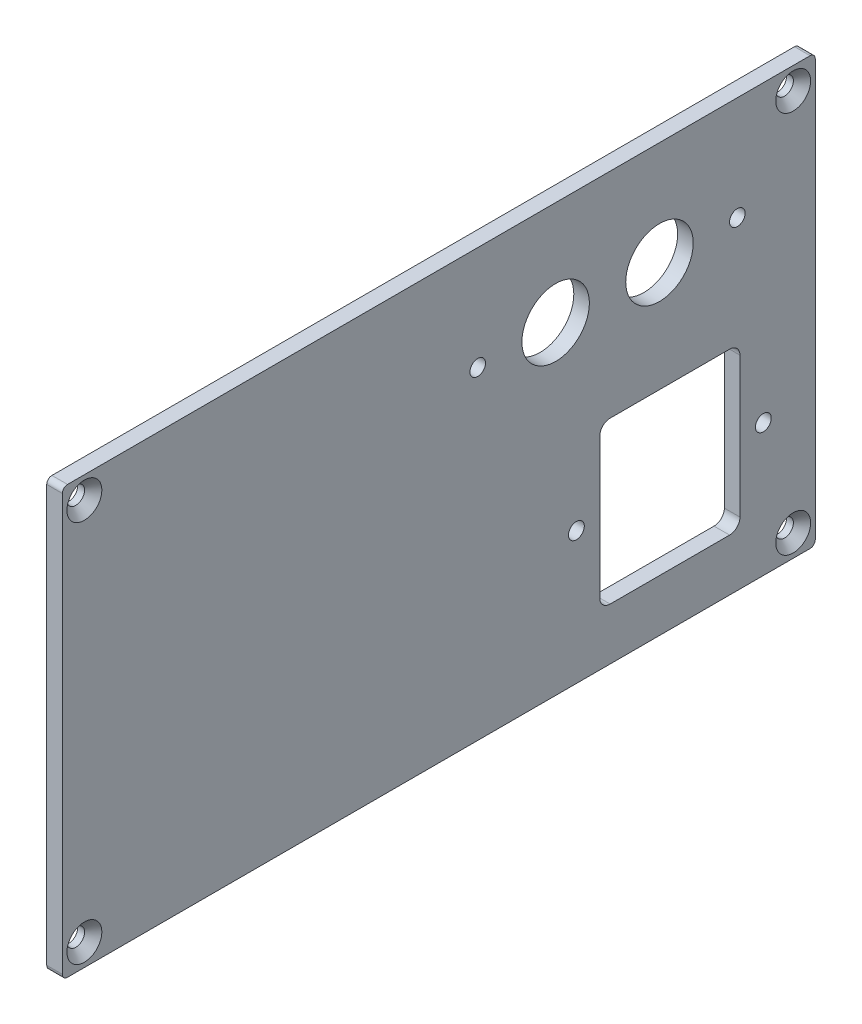
ISO-10303-21;
HEADER;
FILE_DESCRIPTION(('STEP AP214'),'2;1');
FILE_NAME('part.step','',(''),(''),'','','');
FILE_SCHEMA(('AUTOMOTIVE_DESIGN { 1 0 10303 214 1 1 1 1 }'));
ENDSEC;
DATA;
#1=APPLICATION_CONTEXT('core data for automotive mechanical design processes');
#2=APPLICATION_PROTOCOL_DEFINITION('international standard','automotive_design',2000,#1);
#3=PRODUCT_CONTEXT('',#1,'mechanical');
#4=PRODUCT('Part','Part','',(#3));
#5=PRODUCT_RELATED_PRODUCT_CATEGORY('part','',(#4));
#6=PRODUCT_DEFINITION_FORMATION('','',#4);
#7=PRODUCT_DEFINITION_CONTEXT('part definition',#1,'design');
#8=PRODUCT_DEFINITION('design','',#6,#7);
#9=PRODUCT_DEFINITION_SHAPE('','',#8);
#10=(LENGTH_UNIT() NAMED_UNIT(*) SI_UNIT(.MILLI.,.METRE.));
#11=(NAMED_UNIT(*) PLANE_ANGLE_UNIT() SI_UNIT($,.RADIAN.));
#12=(NAMED_UNIT(*) SI_UNIT($,.STERADIAN.) SOLID_ANGLE_UNIT());
#13=UNCERTAINTY_MEASURE_WITH_UNIT(LENGTH_MEASURE(1.E-05),#10,'distance_accuracy_value','');
#14=(GEOMETRIC_REPRESENTATION_CONTEXT(3) GLOBAL_UNCERTAINTY_ASSIGNED_CONTEXT((#13)) GLOBAL_UNIT_ASSIGNED_CONTEXT((#10,
#11,#12)) REPRESENTATION_CONTEXT('',''));
#15=CARTESIAN_POINT('',(0.,0.,0.));
#16=DIRECTION('',(0.,0.,1.));
#17=DIRECTION('',(1.,0.,0.));
#18=AXIS2_PLACEMENT_3D('',#15,#16,#17);
#19=CARTESIAN_POINT('',(3.,-40.1,71.5));
#20=DIRECTION('',(1.,0.,0.));
#21=DIRECTION('',(0.,0.,-1.));
#22=AXIS2_PLACEMENT_3D('',#19,#20,#21);
#23=PLANE('',#22);
#24=CARTESIAN_POINT('',(3.,36.85,68.25));
#25=DIRECTION('',(1.,0.,0.));
#26=DIRECTION('',(0.,0.,-1.));
#27=AXIS2_PLACEMENT_3D('',#24,#25,#26);
#28=CIRCLE('',#27,3.36);
#29=CARTESIAN_POINT('',(3.,36.85,64.89));
#30=VERTEX_POINT('',#29);
#31=EDGE_CURVE('E447',#30,#30,#28,.T.);
#32=ORIENTED_EDGE('',*,*,#31,.F.);
#33=EDGE_LOOP('',(#32));
#34=FACE_BOUND('',#33,.T.);
#35=CARTESIAN_POINT('',(3.,36.85,-68.25));
#36=DIRECTION('',(1.,0.,0.));
#37=DIRECTION('',(0.,0.,-1.));
#38=AXIS2_PLACEMENT_3D('',#35,#36,#37);
#39=CIRCLE('',#38,3.36);
#40=CARTESIAN_POINT('',(3.,36.85,-71.61));
#41=VERTEX_POINT('',#40);
#42=EDGE_CURVE('E454',#41,#41,#39,.T.);
#43=ORIENTED_EDGE('',*,*,#42,.F.);
#44=EDGE_LOOP('',(#43));
#45=FACE_BOUND('',#44,.T.);
#46=CARTESIAN_POINT('',(3.,-36.85,-68.25));
#47=DIRECTION('',(1.,0.,0.));
#48=DIRECTION('',(0.,0.,-1.));
#49=AXIS2_PLACEMENT_3D('',#46,#47,#48);
#50=CIRCLE('',#49,3.36);
#51=CARTESIAN_POINT('',(3.,-36.85,-71.61));
#52=VERTEX_POINT('',#51);
#53=EDGE_CURVE('E463',#52,#52,#50,.T.);
#54=ORIENTED_EDGE('',*,*,#53,.F.);
#55=EDGE_LOOP('',(#54));
#56=FACE_BOUND('',#55,.T.);
#57=CARTESIAN_POINT('',(3.,-36.85,68.25));
#58=DIRECTION('',(1.,0.,0.));
#59=DIRECTION('',(0.,0.,-1.));
#60=AXIS2_PLACEMENT_3D('',#57,#58,#59);
#61=CIRCLE('',#60,3.36);
#62=CARTESIAN_POINT('',(3.,-36.85,64.89));
#63=VERTEX_POINT('',#62);
#64=EDGE_CURVE('E472',#63,#63,#61,.T.);
#65=ORIENTED_EDGE('',*,*,#64,.F.);
#66=EDGE_LOOP('',(#65));
#67=FACE_BOUND('',#66,.T.);
#68=CARTESIAN_POINT('',(3.,-15.6,-62.5));
#69=DIRECTION('',(1.,0.,0.));
#70=DIRECTION('',(0.,0.,1.));
#71=AXIS2_PLACEMENT_3D('',#68,#69,#70);
#72=CIRCLE('',#71,1.52500000000001);
#73=CARTESIAN_POINT('',(3.,-15.6,-60.975));
#74=VERTEX_POINT('',#73);
#75=EDGE_CURVE('E488',#74,#74,#72,.T.);
#76=ORIENTED_EDGE('',*,*,#75,.F.);
#77=EDGE_LOOP('',(#76));
#78=FACE_BOUND('',#77,.T.);
#79=DIRECTION('',(0.,1.,0.));
#80=VECTOR('',#79,1.);
#81=CARTESIAN_POINT('',(3.,-2.10000000000001,-58.));
#82=LINE('',#81,#80);
#83=CARTESIAN_POINT('',(3.,-29.1,-58.));
#84=VERTEX_POINT('',#83);
#85=CARTESIAN_POINT('',(3.,-2.10000000000001,-58.));
#86=VERTEX_POINT('',#85);
#87=EDGE_CURVE('E154',#84,#86,#82,.T.);
#88=ORIENTED_EDGE('',*,*,#87,.F.);
#89=CARTESIAN_POINT('',(3.,-29.1,-56.));
#90=DIRECTION('',(1.,0.,0.));
#91=DIRECTION('',(0.,0.,-1.));
#92=AXIS2_PLACEMENT_3D('',#89,#90,#91);
#93=CIRCLE('',#92,2.00000000000001);
#94=CARTESIAN_POINT('',(3.,-31.1,-56.));
#95=VERTEX_POINT('',#94);
#96=EDGE_CURVE('E146',#95,#84,#93,.T.);
#97=ORIENTED_EDGE('',*,*,#96,.F.);
#98=DIRECTION('',(0.,0.,-1.));
#99=VECTOR('',#98,1.);
#100=CARTESIAN_POINT('',(3.,-31.1,-33.));
#101=LINE('',#100,#99);
#102=CARTESIAN_POINT('',(3.,-31.1,-33.));
#103=VERTEX_POINT('',#102);
#104=EDGE_CURVE('E181',#103,#95,#101,.T.);
#105=ORIENTED_EDGE('',*,*,#104,.F.);
#106=CARTESIAN_POINT('',(3.,-29.1,-33.));
#107=DIRECTION('',(1.,0.,0.));
#108=DIRECTION('',(0.,0.,-1.));
#109=AXIS2_PLACEMENT_3D('',#106,#107,#108);
#110=CIRCLE('',#109,2.);
#111=CARTESIAN_POINT('',(3.,-29.1,-31.));
#112=VERTEX_POINT('',#111);
#113=EDGE_CURVE('E179',#112,#103,#110,.T.);
#114=ORIENTED_EDGE('',*,*,#113,.F.);
#115=DIRECTION('',(0.,-1.,0.));
#116=VECTOR('',#115,1.);
#117=CARTESIAN_POINT('',(3.,-2.10000000000002,-31.));
#118=LINE('',#117,#116);
#119=CARTESIAN_POINT('',(3.,-2.10000000000002,-31.));
#120=VERTEX_POINT('',#119);
#121=EDGE_CURVE('E177',#120,#112,#118,.T.);
#122=ORIENTED_EDGE('',*,*,#121,.F.);
#123=CARTESIAN_POINT('',(3.,-2.10000000000001,-33.));
#124=DIRECTION('',(1.,0.,0.));
#125=DIRECTION('',(0.,0.,-1.));
#126=AXIS2_PLACEMENT_3D('',#123,#124,#125);
#127=CIRCLE('',#126,2.00000000000001);
#128=CARTESIAN_POINT('',(3.,-0.100000000000009,-33.));
#129=VERTEX_POINT('',#128);
#130=EDGE_CURVE('E175',#129,#120,#127,.T.);
#131=ORIENTED_EDGE('',*,*,#130,.F.);
#132=DIRECTION('',(0.,0.,1.));
#133=VECTOR('',#132,1.);
#134=CARTESIAN_POINT('',(3.,-0.0999999999999985,-33.));
#135=LINE('',#134,#133);
#136=CARTESIAN_POINT('',(3.,-0.0999999999999959,-56.));
#137=VERTEX_POINT('',#136);
#138=EDGE_CURVE('E170',#137,#129,#135,.T.);
#139=ORIENTED_EDGE('',*,*,#138,.F.);
#140=CARTESIAN_POINT('',(3.,-2.10000000000001,-56.));
#141=DIRECTION('',(1.,0.,0.));
#142=DIRECTION('',(0.,0.,1.));
#143=AXIS2_PLACEMENT_3D('',#140,#141,#142);
#144=CIRCLE('',#143,2.00000000000001);
#145=EDGE_CURVE('E168',#86,#137,#144,.T.);
#146=ORIENTED_EDGE('',*,*,#145,.F.);
#147=EDGE_LOOP('',(#88,#97,#105,#114,#122,#131,#139,#146));
#148=FACE_BOUND('',#147,.T.);
#149=CARTESIAN_POINT('',(3.,21.1,-57.5));
#150=DIRECTION('',(1.,0.,0.));
#151=DIRECTION('',(0.,0.,1.));
#152=AXIS2_PLACEMENT_3D('',#149,#150,#151);
#153=CIRCLE('',#152,1.5);
#154=CARTESIAN_POINT('',(3.,21.1,-56.));
#155=VERTEX_POINT('',#154);
#156=EDGE_CURVE('E214',#155,#155,#153,.T.);
#157=ORIENTED_EDGE('',*,*,#156,.F.);
#158=EDGE_LOOP('',(#157));
#159=FACE_BOUND('',#158,.T.);
#160=CARTESIAN_POINT('',(3.,21.1,-22.5));
#161=DIRECTION('',(1.,0.,0.));
#162=DIRECTION('',(0.,0.,-1.));
#163=AXIS2_PLACEMENT_3D('',#160,#161,#162);
#164=CIRCLE('',#163,6.5);
#165=CARTESIAN_POINT('',(3.,21.1,-29.));
#166=VERTEX_POINT('',#165);
#167=EDGE_CURVE('E226',#166,#166,#164,.T.);
#168=ORIENTED_EDGE('',*,*,#167,.F.);
#169=EDGE_LOOP('',(#168));
#170=FACE_BOUND('',#169,.T.);
#171=CARTESIAN_POINT('',(3.,-40.1,71.5));
#172=DIRECTION('',(1.,0.,0.));
#173=DIRECTION('',(0.,0.,-1.));
#174=AXIS2_PLACEMENT_3D('',#171,#172,#173);
#175=CIRCLE('',#174,0.999999999999994);
#176=CARTESIAN_POINT('',(3.,-40.1,72.5));
#177=VERTEX_POINT('',#176);
#178=CARTESIAN_POINT('',(3.,-41.1,71.5));
#179=VERTEX_POINT('',#178);
#180=EDGE_CURVE('E232',#177,#179,#175,.T.);
#181=ORIENTED_EDGE('',*,*,#180,.T.);
#182=DIRECTION('',(0.,0.,-1.));
#183=VECTOR('',#182,1.);
#184=CARTESIAN_POINT('',(3.,-41.1,71.5));
#185=LINE('',#184,#183);
#186=CARTESIAN_POINT('',(3.,-41.1,-71.5));
#187=VERTEX_POINT('',#186);
#188=EDGE_CURVE('E235',#179,#187,#185,.T.);
#189=ORIENTED_EDGE('',*,*,#188,.T.);
#190=CARTESIAN_POINT('',(3.,-40.1,-71.5));
#191=DIRECTION('',(1.,0.,0.));
#192=DIRECTION('',(0.,0.,-1.));
#193=AXIS2_PLACEMENT_3D('',#190,#191,#192);
#194=CIRCLE('',#193,1.00000000000001);
#195=CARTESIAN_POINT('',(3.,-40.1,-72.5));
#196=VERTEX_POINT('',#195);
#197=EDGE_CURVE('E238',#187,#196,#194,.T.);
#198=ORIENTED_EDGE('',*,*,#197,.T.);
#199=DIRECTION('',(0.,1.,0.));
#200=VECTOR('',#199,1.);
#201=CARTESIAN_POINT('',(3.,40.1,-72.5));
#202=LINE('',#201,#200);
#203=CARTESIAN_POINT('',(3.,40.1,-72.5));
#204=VERTEX_POINT('',#203);
#205=EDGE_CURVE('E240',#196,#204,#202,.T.);
#206=ORIENTED_EDGE('',*,*,#205,.T.);
#207=CARTESIAN_POINT('',(3.,40.1,-71.5));
#208=DIRECTION('',(1.,0.,0.));
#209=DIRECTION('',(0.,0.,1.));
#210=AXIS2_PLACEMENT_3D('',#207,#208,#209);
#211=CIRCLE('',#210,1.);
#212=CARTESIAN_POINT('',(3.,41.1,-71.5));
#213=VERTEX_POINT('',#212);
#214=EDGE_CURVE('E242',#204,#213,#211,.T.);
#215=ORIENTED_EDGE('',*,*,#214,.T.);
#216=DIRECTION('',(0.,0.,1.));
#217=VECTOR('',#216,1.);
#218=CARTESIAN_POINT('',(3.,41.1,71.5));
#219=LINE('',#218,#217);
#220=CARTESIAN_POINT('',(3.,41.1,71.5));
#221=VERTEX_POINT('',#220);
#222=EDGE_CURVE('E244',#213,#221,#219,.T.);
#223=ORIENTED_EDGE('',*,*,#222,.T.);
#224=CARTESIAN_POINT('',(3.,40.1,71.5));
#225=DIRECTION('',(1.,0.,0.));
#226=DIRECTION('',(0.,0.,-1.));
#227=AXIS2_PLACEMENT_3D('',#224,#225,#226);
#228=CIRCLE('',#227,1.);
#229=CARTESIAN_POINT('',(3.,40.1,72.5));
#230=VERTEX_POINT('',#229);
#231=EDGE_CURVE('E246',#221,#230,#228,.T.);
#232=ORIENTED_EDGE('',*,*,#231,.T.);
#233=DIRECTION('',(0.,-1.,0.));
#234=VECTOR('',#233,1.);
#235=CARTESIAN_POINT('',(3.,40.1,72.5));
#236=LINE('',#235,#234);
#237=EDGE_CURVE('E248',#230,#177,#236,.T.);
#238=ORIENTED_EDGE('',*,*,#237,.T.);
#239=EDGE_LOOP('',(#181,#189,#198,#206,#215,#223,#232,#238));
#240=FACE_BOUND('',#239,.T.);
#241=CARTESIAN_POINT('',(3.,21.1,-7.5));
#242=DIRECTION('',(1.,0.,0.));
#243=DIRECTION('',(0.,0.,-1.));
#244=AXIS2_PLACEMENT_3D('',#241,#242,#243);
#245=CIRCLE('',#244,1.5);
#246=CARTESIAN_POINT('',(3.,21.1,-9.));
#247=VERTEX_POINT('',#246);
#248=EDGE_CURVE('E220',#247,#247,#245,.T.);
#249=ORIENTED_EDGE('',*,*,#248,.F.);
#250=EDGE_LOOP('',(#249));
#251=FACE_BOUND('',#250,.T.);
#252=CARTESIAN_POINT('',(3.,-15.6,-26.5));
#253=DIRECTION('',(1.,0.,0.));
#254=DIRECTION('',(0.,0.,-1.));
#255=AXIS2_PLACEMENT_3D('',#252,#253,#254);
#256=CIRCLE('',#255,1.525);
#257=CARTESIAN_POINT('',(3.,-15.6,-28.025));
#258=VERTEX_POINT('',#257);
#259=EDGE_CURVE('E184',#258,#258,#256,.T.);
#260=ORIENTED_EDGE('',*,*,#259,.F.);
#261=EDGE_LOOP('',(#260));
#262=FACE_BOUND('',#261,.T.);
#263=CARTESIAN_POINT('',(3.,21.1,-42.5));
#264=DIRECTION('',(1.,0.,0.));
#265=DIRECTION('',(0.,0.,1.));
#266=AXIS2_PLACEMENT_3D('',#263,#264,#265);
#267=CIRCLE('',#266,6.5);
#268=CARTESIAN_POINT('',(3.,21.1,-36.));
#269=VERTEX_POINT('',#268);
#270=EDGE_CURVE('E482',#269,#269,#267,.T.);
#271=ORIENTED_EDGE('',*,*,#270,.F.);
#272=EDGE_LOOP('',(#271));
#273=FACE_BOUND('',#272,.T.);
#274=ADVANCED_FACE('F33',(#34,#45,#56,#67,#78,#148,#159,#170,#240,#251,#262,#273),#23,.T.);
#275=CARTESIAN_POINT('',(0.,-40.1,71.5));
#276=DIRECTION('',(1.,0.,0.));
#277=DIRECTION('',(0.,0.,-1.));
#278=AXIS2_PLACEMENT_3D('',#275,#276,#277);
#279=PLANE('',#278);
#280=CARTESIAN_POINT('',(0.,36.85,68.25));
#281=DIRECTION('',(1.,0.,0.));
#282=DIRECTION('',(0.,0.,-1.));
#283=AXIS2_PLACEMENT_3D('',#280,#281,#282);
#284=CIRCLE('',#283,1.69999999999999);
#285=CARTESIAN_POINT('',(0.,36.85,66.55));
#286=VERTEX_POINT('',#285);
#287=EDGE_CURVE('E449',#286,#286,#284,.T.);
#288=ORIENTED_EDGE('',*,*,#287,.T.);
#289=EDGE_LOOP('',(#288));
#290=FACE_BOUND('',#289,.T.);
#291=CARTESIAN_POINT('',(0.,36.85,-68.25));
#292=DIRECTION('',(1.,0.,0.));
#293=DIRECTION('',(0.,0.,-1.));
#294=AXIS2_PLACEMENT_3D('',#291,#292,#293);
#295=CIRCLE('',#294,1.69999999999999);
#296=CARTESIAN_POINT('',(0.,36.85,-69.95));
#297=VERTEX_POINT('',#296);
#298=EDGE_CURVE('E460',#297,#297,#295,.T.);
#299=ORIENTED_EDGE('',*,*,#298,.T.);
#300=EDGE_LOOP('',(#299));
#301=FACE_BOUND('',#300,.T.);
#302=CARTESIAN_POINT('',(0.,-36.85,-68.25));
#303=DIRECTION('',(1.,0.,0.));
#304=DIRECTION('',(0.,0.,-1.));
#305=AXIS2_PLACEMENT_3D('',#302,#303,#304);
#306=CIRCLE('',#305,1.69999999999999);
#307=CARTESIAN_POINT('',(0.,-36.85,-69.95));
#308=VERTEX_POINT('',#307);
#309=EDGE_CURVE('E469',#308,#308,#306,.T.);
#310=ORIENTED_EDGE('',*,*,#309,.T.);
#311=EDGE_LOOP('',(#310));
#312=FACE_BOUND('',#311,.T.);
#313=CARTESIAN_POINT('',(0.,-36.85,68.25));
#314=DIRECTION('',(1.,0.,0.));
#315=DIRECTION('',(0.,0.,-1.));
#316=AXIS2_PLACEMENT_3D('',#313,#314,#315);
#317=CIRCLE('',#316,1.69999999999999);
#318=CARTESIAN_POINT('',(0.,-36.85,66.55));
#319=VERTEX_POINT('',#318);
#320=EDGE_CURVE('E478',#319,#319,#317,.T.);
#321=ORIENTED_EDGE('',*,*,#320,.T.);
#322=EDGE_LOOP('',(#321));
#323=FACE_BOUND('',#322,.T.);
#324=CARTESIAN_POINT('',(0.,21.1,-57.5));
#325=DIRECTION('',(1.,0.,0.));
#326=DIRECTION('',(0.,0.,1.));
#327=AXIS2_PLACEMENT_3D('',#324,#325,#326);
#328=CIRCLE('',#327,1.5);
#329=CARTESIAN_POINT('',(0.,21.1,-56.));
#330=VERTEX_POINT('',#329);
#331=EDGE_CURVE('E162',#330,#330,#328,.T.);
#332=ORIENTED_EDGE('',*,*,#331,.T.);
#333=EDGE_LOOP('',(#332));
#334=FACE_BOUND('',#333,.T.);
#335=CARTESIAN_POINT('',(0.,21.1,-7.5));
#336=DIRECTION('',(1.,0.,0.));
#337=DIRECTION('',(0.,0.,-1.));
#338=AXIS2_PLACEMENT_3D('',#335,#336,#337);
#339=CIRCLE('',#338,1.5);
#340=CARTESIAN_POINT('',(0.,21.1,-9.));
#341=VERTEX_POINT('',#340);
#342=EDGE_CURVE('E217',#341,#341,#339,.T.);
#343=ORIENTED_EDGE('',*,*,#342,.T.);
#344=EDGE_LOOP('',(#343));
#345=FACE_BOUND('',#344,.T.);
#346=CARTESIAN_POINT('',(0.,21.1,-22.5));
#347=DIRECTION('',(1.,0.,0.));
#348=DIRECTION('',(0.,0.,-1.));
#349=AXIS2_PLACEMENT_3D('',#346,#347,#348);
#350=CIRCLE('',#349,6.5);
#351=CARTESIAN_POINT('',(0.,21.1,-29.));
#352=VERTEX_POINT('',#351);
#353=EDGE_CURVE('E223',#352,#352,#350,.T.);
#354=ORIENTED_EDGE('',*,*,#353,.T.);
#355=EDGE_LOOP('',(#354));
#356=FACE_BOUND('',#355,.T.);
#357=CARTESIAN_POINT('',(0.,-40.1,71.5));
#358=DIRECTION('',(1.,0.,0.));
#359=DIRECTION('',(0.,0.,-1.));
#360=AXIS2_PLACEMENT_3D('',#357,#358,#359);
#361=CIRCLE('',#360,0.999999999999994);
#362=CARTESIAN_POINT('',(0.,-40.1,72.5));
#363=VERTEX_POINT('',#362);
#364=CARTESIAN_POINT('',(0.,-41.1,71.5));
#365=VERTEX_POINT('',#364);
#366=EDGE_CURVE('E229',#363,#365,#361,.T.);
#367=ORIENTED_EDGE('',*,*,#366,.F.);
#368=DIRECTION('',(0.,-1.,0.));
#369=VECTOR('',#368,1.);
#370=CARTESIAN_POINT('',(0.,40.1,72.5));
#371=LINE('',#370,#369);
#372=CARTESIAN_POINT('',(0.,40.1,72.5));
#373=VERTEX_POINT('',#372);
#374=EDGE_CURVE('E236',#373,#363,#371,.T.);
#375=ORIENTED_EDGE('',*,*,#374,.F.);
#376=CARTESIAN_POINT('',(0.,40.1,71.5));
#377=DIRECTION('',(1.,0.,0.));
#378=DIRECTION('',(0.,0.,-1.));
#379=AXIS2_PLACEMENT_3D('',#376,#377,#378);
#380=CIRCLE('',#379,1.);
#381=CARTESIAN_POINT('',(0.,41.1,71.5));
#382=VERTEX_POINT('',#381);
#383=EDGE_CURVE('E263',#382,#373,#380,.T.);
#384=ORIENTED_EDGE('',*,*,#383,.F.);
#385=DIRECTION('',(0.,0.,1.));
#386=VECTOR('',#385,1.);
#387=CARTESIAN_POINT('',(0.,41.1,71.5));
#388=LINE('',#387,#386);
#389=CARTESIAN_POINT('',(0.,41.1,-71.5));
#390=VERTEX_POINT('',#389);
#391=EDGE_CURVE('E261',#390,#382,#388,.T.);
#392=ORIENTED_EDGE('',*,*,#391,.F.);
#393=CARTESIAN_POINT('',(0.,40.1,-71.5));
#394=DIRECTION('',(1.,0.,0.));
#395=DIRECTION('',(0.,0.,1.));
#396=AXIS2_PLACEMENT_3D('',#393,#394,#395);
#397=CIRCLE('',#396,1.);
#398=CARTESIAN_POINT('',(0.,40.1,-72.5));
#399=VERTEX_POINT('',#398);
#400=EDGE_CURVE('E259',#399,#390,#397,.T.);
#401=ORIENTED_EDGE('',*,*,#400,.F.);
#402=DIRECTION('',(0.,1.,0.));
#403=VECTOR('',#402,1.);
#404=CARTESIAN_POINT('',(0.,40.1,-72.5));
#405=LINE('',#404,#403);
#406=CARTESIAN_POINT('',(0.,-40.1,-72.5));
#407=VERTEX_POINT('',#406);
#408=EDGE_CURVE('E257',#407,#399,#405,.T.);
#409=ORIENTED_EDGE('',*,*,#408,.F.);
#410=CARTESIAN_POINT('',(0.,-40.1,-71.5));
#411=DIRECTION('',(1.,0.,0.));
#412=DIRECTION('',(0.,0.,-1.));
#413=AXIS2_PLACEMENT_3D('',#410,#411,#412);
#414=CIRCLE('',#413,1.00000000000001);
#415=CARTESIAN_POINT('',(0.,-41.1,-71.5));
#416=VERTEX_POINT('',#415);
#417=EDGE_CURVE('E255',#416,#407,#414,.T.);
#418=ORIENTED_EDGE('',*,*,#417,.F.);
#419=DIRECTION('',(0.,0.,-1.));
#420=VECTOR('',#419,1.);
#421=CARTESIAN_POINT('',(0.,-41.1,71.5));
#422=LINE('',#421,#420);
#423=EDGE_CURVE('E253',#365,#416,#422,.T.);
#424=ORIENTED_EDGE('',*,*,#423,.F.);
#425=EDGE_LOOP('',(#367,#375,#384,#392,#401,#409,#418,#424));
#426=FACE_BOUND('',#425,.T.);
#427=CARTESIAN_POINT('',(0.,-29.1,-56.));
#428=DIRECTION('',(1.,0.,0.));
#429=DIRECTION('',(0.,0.,-1.));
#430=AXIS2_PLACEMENT_3D('',#427,#428,#429);
#431=CIRCLE('',#430,2.00000000000001);
#432=CARTESIAN_POINT('',(0.,-31.1,-56.));
#433=VERTEX_POINT('',#432);
#434=CARTESIAN_POINT('',(0.,-29.1,-58.));
#435=VERTEX_POINT('',#434);
#436=EDGE_CURVE('E56',#433,#435,#431,.T.);
#437=ORIENTED_EDGE('',*,*,#436,.T.);
#438=DIRECTION('',(0.,1.,0.));
#439=VECTOR('',#438,1.);
#440=CARTESIAN_POINT('',(0.,-2.10000000000001,-58.));
#441=LINE('',#440,#439);
#442=CARTESIAN_POINT('',(0.,-2.10000000000001,-58.));
#443=VERTEX_POINT('',#442);
#444=EDGE_CURVE('E161',#435,#443,#441,.T.);
#445=ORIENTED_EDGE('',*,*,#444,.T.);
#446=CARTESIAN_POINT('',(0.,-2.10000000000001,-56.));
#447=DIRECTION('',(1.,0.,0.));
#448=DIRECTION('',(0.,0.,1.));
#449=AXIS2_PLACEMENT_3D('',#446,#447,#448);
#450=CIRCLE('',#449,2.00000000000001);
#451=CARTESIAN_POINT('',(0.,-0.0999999999999959,-56.));
#452=VERTEX_POINT('',#451);
#453=EDGE_CURVE('E186',#443,#452,#450,.T.);
#454=ORIENTED_EDGE('',*,*,#453,.T.);
#455=DIRECTION('',(0.,0.,1.));
#456=VECTOR('',#455,1.);
#457=CARTESIAN_POINT('',(0.,-0.0999999999999985,-33.));
#458=LINE('',#457,#456);
#459=CARTESIAN_POINT('',(0.,-0.100000000000009,-33.));
#460=VERTEX_POINT('',#459);
#461=EDGE_CURVE('E189',#452,#460,#458,.T.);
#462=ORIENTED_EDGE('',*,*,#461,.T.);
#463=CARTESIAN_POINT('',(0.,-2.10000000000001,-33.));
#464=DIRECTION('',(1.,0.,0.));
#465=DIRECTION('',(0.,0.,-1.));
#466=AXIS2_PLACEMENT_3D('',#463,#464,#465);
#467=CIRCLE('',#466,2.00000000000001);
#468=CARTESIAN_POINT('',(0.,-2.10000000000002,-31.));
#469=VERTEX_POINT('',#468);
#470=EDGE_CURVE('E192',#460,#469,#467,.T.);
#471=ORIENTED_EDGE('',*,*,#470,.T.);
#472=DIRECTION('',(0.,-1.,0.));
#473=VECTOR('',#472,1.);
#474=CARTESIAN_POINT('',(0.,-2.10000000000002,-31.));
#475=LINE('',#474,#473);
#476=CARTESIAN_POINT('',(0.,-29.1,-31.));
#477=VERTEX_POINT('',#476);
#478=EDGE_CURVE('E195',#469,#477,#475,.T.);
#479=ORIENTED_EDGE('',*,*,#478,.T.);
#480=CARTESIAN_POINT('',(0.,-29.1,-33.));
#481=DIRECTION('',(1.,0.,0.));
#482=DIRECTION('',(0.,0.,-1.));
#483=AXIS2_PLACEMENT_3D('',#480,#481,#482);
#484=CIRCLE('',#483,2.);
#485=CARTESIAN_POINT('',(0.,-31.1,-33.));
#486=VERTEX_POINT('',#485);
#487=EDGE_CURVE('E198',#477,#486,#484,.T.);
#488=ORIENTED_EDGE('',*,*,#487,.T.);
#489=DIRECTION('',(0.,0.,-1.));
#490=VECTOR('',#489,1.);
#491=CARTESIAN_POINT('',(0.,-31.1,-33.));
#492=LINE('',#491,#490);
#493=EDGE_CURVE('E155',#486,#433,#492,.T.);
#494=ORIENTED_EDGE('',*,*,#493,.T.);
#495=EDGE_LOOP('',(#437,#445,#454,#462,#471,#479,#488,#494));
#496=FACE_BOUND('',#495,.T.);
#497=CARTESIAN_POINT('',(0.,-15.6,-26.5));
#498=DIRECTION('',(1.,0.,0.));
#499=DIRECTION('',(0.,0.,-1.));
#500=AXIS2_PLACEMENT_3D('',#497,#498,#499);
#501=CIRCLE('',#500,1.525);
#502=CARTESIAN_POINT('',(0.,-15.6,-28.025));
#503=VERTEX_POINT('',#502);
#504=EDGE_CURVE('E491',#503,#503,#501,.T.);
#505=ORIENTED_EDGE('',*,*,#504,.T.);
#506=EDGE_LOOP('',(#505));
#507=FACE_BOUND('',#506,.T.);
#508=CARTESIAN_POINT('',(0.,-15.6,-62.5));
#509=DIRECTION('',(1.,0.,0.));
#510=DIRECTION('',(0.,0.,1.));
#511=AXIS2_PLACEMENT_3D('',#508,#509,#510);
#512=CIRCLE('',#511,1.52500000000001);
#513=CARTESIAN_POINT('',(0.,-15.6,-60.975));
#514=VERTEX_POINT('',#513);
#515=EDGE_CURVE('E485',#514,#514,#512,.T.);
#516=ORIENTED_EDGE('',*,*,#515,.T.);
#517=EDGE_LOOP('',(#516));
#518=FACE_BOUND('',#517,.T.);
#519=CARTESIAN_POINT('',(0.,21.1,-42.5));
#520=DIRECTION('',(1.,0.,0.));
#521=DIRECTION('',(0.,0.,1.));
#522=AXIS2_PLACEMENT_3D('',#519,#520,#521);
#523=CIRCLE('',#522,6.5);
#524=CARTESIAN_POINT('',(0.,21.1,-36.));
#525=VERTEX_POINT('',#524);
#526=EDGE_CURVE('E481',#525,#525,#523,.T.);
#527=ORIENTED_EDGE('',*,*,#526,.T.);
#528=EDGE_LOOP('',(#527));
#529=FACE_BOUND('',#528,.T.);
#530=ADVANCED_FACE('F293',(#290,#301,#312,#323,#334,#345,#356,#426,#496,#507,#518,#529),#279,.F.);
#531=CARTESIAN_POINT('',(3.,-40.1,71.5));
#532=DIRECTION('',(-1.,0.,0.));
#533=DIRECTION('',(0.,0.,1.));
#534=AXIS2_PLACEMENT_3D('',#531,#532,#533);
#535=CYLINDRICAL_SURFACE('',#534,0.999999999999994);
#536=ORIENTED_EDGE('',*,*,#366,.T.);
#537=DIRECTION('',(-1.,0.,0.));
#538=VECTOR('',#537,1.);
#539=CARTESIAN_POINT('',(3.,-41.1,71.5));
#540=LINE('',#539,#538);
#541=EDGE_CURVE('E11',#179,#365,#540,.T.);
#542=ORIENTED_EDGE('',*,*,#541,.F.);
#543=ORIENTED_EDGE('',*,*,#180,.F.);
#544=DIRECTION('',(-1.,0.,0.));
#545=VECTOR('',#544,1.);
#546=CARTESIAN_POINT('',(3.,-40.1,72.5));
#547=LINE('',#546,#545);
#548=EDGE_CURVE('E250',#177,#363,#547,.T.);
#549=ORIENTED_EDGE('',*,*,#548,.T.);
#550=EDGE_LOOP('',(#536,#542,#543,#549));
#551=FACE_BOUND('',#550,.T.);
#552=ADVANCED_FACE('F35',(#551),#535,.T.);
#553=CARTESIAN_POINT('',(3.,-41.1,71.5));
#554=DIRECTION('',(0.,1.,0.));
#555=DIRECTION('',(0.,0.,1.));
#556=AXIS2_PLACEMENT_3D('',#553,#554,#555);
#557=PLANE('',#556);
#558=ORIENTED_EDGE('',*,*,#423,.T.);
#559=DIRECTION('',(-1.,0.,0.));
#560=VECTOR('',#559,1.);
#561=CARTESIAN_POINT('',(3.,-41.1,-71.5));
#562=LINE('',#561,#560);
#563=EDGE_CURVE('E41',#187,#416,#562,.T.);
#564=ORIENTED_EDGE('',*,*,#563,.F.);
#565=ORIENTED_EDGE('',*,*,#188,.F.);
#566=ORIENTED_EDGE('',*,*,#541,.T.);
#567=EDGE_LOOP('',(#558,#564,#565,#566));
#568=FACE_BOUND('',#567,.T.);
#569=ADVANCED_FACE('F311',(#568),#557,.F.);
#570=CARTESIAN_POINT('',(3.,-40.1,-71.5));
#571=DIRECTION('',(-1.,0.,0.));
#572=DIRECTION('',(0.,0.,1.));
#573=AXIS2_PLACEMENT_3D('',#570,#571,#572);
#574=CYLINDRICAL_SURFACE('',#573,1.00000000000001);
#575=ORIENTED_EDGE('',*,*,#417,.T.);
#576=DIRECTION('',(-1.,0.,0.));
#577=VECTOR('',#576,1.);
#578=CARTESIAN_POINT('',(3.,-40.1,-72.5));
#579=LINE('',#578,#577);
#580=EDGE_CURVE('E280',#196,#407,#579,.T.);
#581=ORIENTED_EDGE('',*,*,#580,.F.);
#582=ORIENTED_EDGE('',*,*,#197,.F.);
#583=ORIENTED_EDGE('',*,*,#563,.T.);
#584=EDGE_LOOP('',(#575,#581,#582,#583));
#585=FACE_BOUND('',#584,.T.);
#586=ADVANCED_FACE('F287',(#585),#574,.T.);
#587=CARTESIAN_POINT('',(3.,40.1,-72.5));
#588=DIRECTION('',(0.,0.,1.));
#589=DIRECTION('',(0.,-1.,0.));
#590=AXIS2_PLACEMENT_3D('',#587,#588,#589);
#591=PLANE('',#590);
#592=ORIENTED_EDGE('',*,*,#408,.T.);
#593=DIRECTION('',(-1.,0.,0.));
#594=VECTOR('',#593,1.);
#595=CARTESIAN_POINT('',(3.,40.1,-72.5));
#596=LINE('',#595,#594);
#597=EDGE_CURVE('E277',#204,#399,#596,.T.);
#598=ORIENTED_EDGE('',*,*,#597,.F.);
#599=ORIENTED_EDGE('',*,*,#205,.F.);
#600=ORIENTED_EDGE('',*,*,#580,.T.);
#601=EDGE_LOOP('',(#592,#598,#599,#600));
#602=FACE_BOUND('',#601,.T.);
#603=ADVANCED_FACE('F299',(#602),#591,.F.);
#604=CARTESIAN_POINT('',(3.,40.1,-71.5));
#605=DIRECTION('',(-1.,0.,0.));
#606=DIRECTION('',(0.,0.,1.));
#607=AXIS2_PLACEMENT_3D('',#604,#605,#606);
#608=CYLINDRICAL_SURFACE('',#607,1.);
#609=ORIENTED_EDGE('',*,*,#400,.T.);
#610=DIRECTION('',(-1.,0.,0.));
#611=VECTOR('',#610,1.);
#612=CARTESIAN_POINT('',(3.,41.1,-71.5));
#613=LINE('',#612,#611);
#614=EDGE_CURVE('E274',#213,#390,#613,.T.);
#615=ORIENTED_EDGE('',*,*,#614,.F.);
#616=ORIENTED_EDGE('',*,*,#214,.F.);
#617=ORIENTED_EDGE('',*,*,#597,.T.);
#618=EDGE_LOOP('',(#609,#615,#616,#617));
#619=FACE_BOUND('',#618,.T.);
#620=ADVANCED_FACE('F303',(#619),#608,.T.);
#621=CARTESIAN_POINT('',(3.,41.1,71.5));
#622=DIRECTION('',(0.,-1.,0.));
#623=DIRECTION('',(0.,0.,-1.));
#624=AXIS2_PLACEMENT_3D('',#621,#622,#623);
#625=PLANE('',#624);
#626=ORIENTED_EDGE('',*,*,#391,.T.);
#627=DIRECTION('',(-1.,0.,0.));
#628=VECTOR('',#627,1.);
#629=CARTESIAN_POINT('',(3.,41.1,71.5));
#630=LINE('',#629,#628);
#631=EDGE_CURVE('E271',#221,#382,#630,.T.);
#632=ORIENTED_EDGE('',*,*,#631,.F.);
#633=ORIENTED_EDGE('',*,*,#222,.F.);
#634=ORIENTED_EDGE('',*,*,#614,.T.);
#635=EDGE_LOOP('',(#626,#632,#633,#634));
#636=FACE_BOUND('',#635,.T.);
#637=ADVANCED_FACE('F324',(#636),#625,.F.);
#638=CARTESIAN_POINT('',(3.,40.1,71.5));
#639=DIRECTION('',(-1.,0.,0.));
#640=DIRECTION('',(0.,0.,1.));
#641=AXIS2_PLACEMENT_3D('',#638,#639,#640);
#642=CYLINDRICAL_SURFACE('',#641,1.);
#643=ORIENTED_EDGE('',*,*,#383,.T.);
#644=DIRECTION('',(-1.,0.,0.));
#645=VECTOR('',#644,1.);
#646=CARTESIAN_POINT('',(3.,40.1,72.5));
#647=LINE('',#646,#645);
#648=EDGE_CURVE('E268',#230,#373,#647,.T.);
#649=ORIENTED_EDGE('',*,*,#648,.F.);
#650=ORIENTED_EDGE('',*,*,#231,.F.);
#651=ORIENTED_EDGE('',*,*,#631,.T.);
#652=EDGE_LOOP('',(#643,#649,#650,#651));
#653=FACE_BOUND('',#652,.T.);
#654=ADVANCED_FACE('F322',(#653),#642,.T.);
#655=CARTESIAN_POINT('',(3.,40.1,72.5));
#656=DIRECTION('',(0.,0.,-1.));
#657=DIRECTION('',(0.,1.,0.));
#658=AXIS2_PLACEMENT_3D('',#655,#656,#657);
#659=PLANE('',#658);
#660=ORIENTED_EDGE('',*,*,#374,.T.);
#661=ORIENTED_EDGE('',*,*,#548,.F.);
#662=ORIENTED_EDGE('',*,*,#237,.F.);
#663=ORIENTED_EDGE('',*,*,#648,.T.);
#664=EDGE_LOOP('',(#660,#661,#662,#663));
#665=FACE_BOUND('',#664,.T.);
#666=ADVANCED_FACE('F317',(#665),#659,.F.);
#667=CARTESIAN_POINT('',(3.,21.1,-22.5));
#668=DIRECTION('',(-1.,0.,0.));
#669=DIRECTION('',(0.,0.,1.));
#670=AXIS2_PLACEMENT_3D('',#667,#668,#669);
#671=CYLINDRICAL_SURFACE('',#670,6.5);
#672=ORIENTED_EDGE('',*,*,#167,.T.);
#673=EDGE_LOOP('',(#672));
#674=FACE_BOUND('',#673,.T.);
#675=ORIENTED_EDGE('',*,*,#353,.F.);
#676=EDGE_LOOP('',(#675));
#677=FACE_BOUND('',#676,.T.);
#678=ADVANCED_FACE('F344',(#674,#677),#671,.F.);
#679=CARTESIAN_POINT('',(3.,21.1,-7.5));
#680=DIRECTION('',(-1.,0.,0.));
#681=DIRECTION('',(0.,0.,1.));
#682=AXIS2_PLACEMENT_3D('',#679,#680,#681);
#683=CYLINDRICAL_SURFACE('',#682,1.5);
#684=ORIENTED_EDGE('',*,*,#248,.T.);
#685=EDGE_LOOP('',(#684));
#686=FACE_BOUND('',#685,.T.);
#687=ORIENTED_EDGE('',*,*,#342,.F.);
#688=EDGE_LOOP('',(#687));
#689=FACE_BOUND('',#688,.T.);
#690=ADVANCED_FACE('F351',(#686,#689),#683,.F.);
#691=CARTESIAN_POINT('',(3.,21.1,-57.5));
#692=DIRECTION('',(-1.,0.,0.));
#693=DIRECTION('',(0.,0.,1.));
#694=AXIS2_PLACEMENT_3D('',#691,#692,#693);
#695=CYLINDRICAL_SURFACE('',#694,1.5);
#696=ORIENTED_EDGE('',*,*,#156,.T.);
#697=EDGE_LOOP('',(#696));
#698=FACE_BOUND('',#697,.T.);
#699=ORIENTED_EDGE('',*,*,#331,.F.);
#700=EDGE_LOOP('',(#699));
#701=FACE_BOUND('',#700,.T.);
#702=ADVANCED_FACE('F356',(#698,#701),#695,.F.);
#703=CARTESIAN_POINT('',(3.,-29.1,-56.));
#704=DIRECTION('',(-1.,0.,0.));
#705=DIRECTION('',(0.,0.,1.));
#706=AXIS2_PLACEMENT_3D('',#703,#704,#705);
#707=CYLINDRICAL_SURFACE('',#706,2.00000000000001);
#708=ORIENTED_EDGE('',*,*,#436,.F.);
#709=DIRECTION('',(-1.,0.,0.));
#710=VECTOR('',#709,1.);
#711=CARTESIAN_POINT('',(3.,-31.1,-56.));
#712=LINE('',#711,#710);
#713=EDGE_CURVE('E150',#95,#433,#712,.T.);
#714=ORIENTED_EDGE('',*,*,#713,.F.);
#715=ORIENTED_EDGE('',*,*,#96,.T.);
#716=DIRECTION('',(-1.,0.,0.));
#717=VECTOR('',#716,1.);
#718=CARTESIAN_POINT('',(3.,-29.1,-58.));
#719=LINE('',#718,#717);
#720=EDGE_CURVE('E149',#84,#435,#719,.T.);
#721=ORIENTED_EDGE('',*,*,#720,.T.);
#722=EDGE_LOOP('',(#708,#714,#715,#721));
#723=FACE_BOUND('',#722,.T.);
#724=ADVANCED_FACE('F148',(#723),#707,.F.);
#725=CARTESIAN_POINT('',(3.,-2.10000000000001,-58.));
#726=DIRECTION('',(0.,0.,1.));
#727=DIRECTION('',(1.,0.,0.));
#728=AXIS2_PLACEMENT_3D('',#725,#726,#727);
#729=PLANE('',#728);
#730=ORIENTED_EDGE('',*,*,#444,.F.);
#731=ORIENTED_EDGE('',*,*,#720,.F.);
#732=ORIENTED_EDGE('',*,*,#87,.T.);
#733=DIRECTION('',(-1.,0.,0.));
#734=VECTOR('',#733,1.);
#735=CARTESIAN_POINT('',(3.,-2.10000000000001,-58.));
#736=LINE('',#735,#734);
#737=EDGE_CURVE('E163',#86,#443,#736,.T.);
#738=ORIENTED_EDGE('',*,*,#737,.T.);
#739=EDGE_LOOP('',(#730,#731,#732,#738));
#740=FACE_BOUND('',#739,.T.);
#741=ADVANCED_FACE('F158',(#740),#729,.T.);
#742=CARTESIAN_POINT('',(3.,-2.10000000000001,-56.));
#743=DIRECTION('',(-1.,0.,0.));
#744=DIRECTION('',(0.,0.,1.));
#745=AXIS2_PLACEMENT_3D('',#742,#743,#744);
#746=CYLINDRICAL_SURFACE('',#745,2.00000000000001);
#747=ORIENTED_EDGE('',*,*,#453,.F.);
#748=ORIENTED_EDGE('',*,*,#737,.F.);
#749=ORIENTED_EDGE('',*,*,#145,.T.);
#750=DIRECTION('',(-1.,0.,0.));
#751=VECTOR('',#750,1.);
#752=CARTESIAN_POINT('',(3.,-0.0999999999999959,-56.));
#753=LINE('',#752,#751);
#754=EDGE_CURVE('E211',#137,#452,#753,.T.);
#755=ORIENTED_EDGE('',*,*,#754,.T.);
#756=EDGE_LOOP('',(#747,#748,#749,#755));
#757=FACE_BOUND('',#756,.T.);
#758=ADVANCED_FACE('F374',(#757),#746,.F.);
#759=CARTESIAN_POINT('',(3.,-0.0999999999999985,-33.));
#760=DIRECTION('',(0.,-1.,0.));
#761=DIRECTION('',(0.,0.,-1.));
#762=AXIS2_PLACEMENT_3D('',#759,#760,#761);
#763=PLANE('',#762);
#764=ORIENTED_EDGE('',*,*,#461,.F.);
#765=ORIENTED_EDGE('',*,*,#754,.F.);
#766=ORIENTED_EDGE('',*,*,#138,.T.);
#767=DIRECTION('',(-1.,0.,0.));
#768=VECTOR('',#767,1.);
#769=CARTESIAN_POINT('',(3.,-0.100000000000009,-33.));
#770=LINE('',#769,#768);
#771=EDGE_CURVE('E209',#129,#460,#770,.T.);
#772=ORIENTED_EDGE('',*,*,#771,.T.);
#773=EDGE_LOOP('',(#764,#765,#766,#772));
#774=FACE_BOUND('',#773,.T.);
#775=ADVANCED_FACE('F377',(#774),#763,.T.);
#776=CARTESIAN_POINT('',(3.,-2.10000000000001,-33.));
#777=DIRECTION('',(-1.,0.,0.));
#778=DIRECTION('',(0.,0.,1.));
#779=AXIS2_PLACEMENT_3D('',#776,#777,#778);
#780=CYLINDRICAL_SURFACE('',#779,2.00000000000001);
#781=ORIENTED_EDGE('',*,*,#470,.F.);
#782=ORIENTED_EDGE('',*,*,#771,.F.);
#783=ORIENTED_EDGE('',*,*,#130,.T.);
#784=DIRECTION('',(-1.,0.,0.));
#785=VECTOR('',#784,1.);
#786=CARTESIAN_POINT('',(3.,-2.10000000000002,-31.));
#787=LINE('',#786,#785);
#788=EDGE_CURVE('E207',#120,#469,#787,.T.);
#789=ORIENTED_EDGE('',*,*,#788,.T.);
#790=EDGE_LOOP('',(#781,#782,#783,#789));
#791=FACE_BOUND('',#790,.T.);
#792=ADVANCED_FACE('F381',(#791),#780,.F.);
#793=CARTESIAN_POINT('',(3.,-2.10000000000002,-31.));
#794=DIRECTION('',(0.,0.,-1.));
#795=DIRECTION('',(0.,1.,0.));
#796=AXIS2_PLACEMENT_3D('',#793,#794,#795);
#797=PLANE('',#796);
#798=ORIENTED_EDGE('',*,*,#478,.F.);
#799=ORIENTED_EDGE('',*,*,#788,.F.);
#800=ORIENTED_EDGE('',*,*,#121,.T.);
#801=DIRECTION('',(-1.,0.,0.));
#802=VECTOR('',#801,1.);
#803=CARTESIAN_POINT('',(3.,-29.1,-31.));
#804=LINE('',#803,#802);
#805=EDGE_CURVE('E205',#112,#477,#804,.T.);
#806=ORIENTED_EDGE('',*,*,#805,.T.);
#807=EDGE_LOOP('',(#798,#799,#800,#806));
#808=FACE_BOUND('',#807,.T.);
#809=ADVANCED_FACE('F385',(#808),#797,.T.);
#810=CARTESIAN_POINT('',(3.,-29.1,-33.));
#811=DIRECTION('',(-1.,0.,0.));
#812=DIRECTION('',(0.,0.,1.));
#813=AXIS2_PLACEMENT_3D('',#810,#811,#812);
#814=CYLINDRICAL_SURFACE('',#813,2.);
#815=ORIENTED_EDGE('',*,*,#487,.F.);
#816=ORIENTED_EDGE('',*,*,#805,.F.);
#817=ORIENTED_EDGE('',*,*,#113,.T.);
#818=DIRECTION('',(-1.,0.,0.));
#819=VECTOR('',#818,1.);
#820=CARTESIAN_POINT('',(3.,-31.1,-33.));
#821=LINE('',#820,#819);
#822=EDGE_CURVE('E48',#103,#486,#821,.T.);
#823=ORIENTED_EDGE('',*,*,#822,.T.);
#824=EDGE_LOOP('',(#815,#816,#817,#823));
#825=FACE_BOUND('',#824,.T.);
#826=ADVANCED_FACE('F389',(#825),#814,.F.);
#827=CARTESIAN_POINT('',(3.,-31.1,-33.));
#828=DIRECTION('',(0.,1.,0.));
#829=DIRECTION('',(0.,0.,1.));
#830=AXIS2_PLACEMENT_3D('',#827,#828,#829);
#831=PLANE('',#830);
#832=ORIENTED_EDGE('',*,*,#493,.F.);
#833=ORIENTED_EDGE('',*,*,#822,.F.);
#834=ORIENTED_EDGE('',*,*,#104,.T.);
#835=ORIENTED_EDGE('',*,*,#713,.T.);
#836=EDGE_LOOP('',(#832,#833,#834,#835));
#837=FACE_BOUND('',#836,.T.);
#838=ADVANCED_FACE('F393',(#837),#831,.T.);
#839=CARTESIAN_POINT('',(3.,-15.6,-26.5));
#840=DIRECTION('',(-1.,0.,0.));
#841=DIRECTION('',(0.,0.,1.));
#842=AXIS2_PLACEMENT_3D('',#839,#840,#841);
#843=CYLINDRICAL_SURFACE('',#842,1.525);
#844=ORIENTED_EDGE('',*,*,#259,.T.);
#845=EDGE_LOOP('',(#844));
#846=FACE_BOUND('',#845,.T.);
#847=ORIENTED_EDGE('',*,*,#504,.F.);
#848=EDGE_LOOP('',(#847));
#849=FACE_BOUND('',#848,.T.);
#850=ADVANCED_FACE('F397',(#846,#849),#843,.F.);
#851=CARTESIAN_POINT('',(3.,-15.6,-62.5));
#852=DIRECTION('',(-1.,0.,0.));
#853=DIRECTION('',(0.,0.,1.));
#854=AXIS2_PLACEMENT_3D('',#851,#852,#853);
#855=CYLINDRICAL_SURFACE('',#854,1.52500000000001);
#856=ORIENTED_EDGE('',*,*,#75,.T.);
#857=EDGE_LOOP('',(#856));
#858=FACE_BOUND('',#857,.T.);
#859=ORIENTED_EDGE('',*,*,#515,.F.);
#860=EDGE_LOOP('',(#859));
#861=FACE_BOUND('',#860,.T.);
#862=ADVANCED_FACE('F400',(#858,#861),#855,.F.);
#863=CARTESIAN_POINT('',(3.,21.1,-42.5));
#864=DIRECTION('',(-1.,0.,0.));
#865=DIRECTION('',(0.,0.,1.));
#866=AXIS2_PLACEMENT_3D('',#863,#864,#865);
#867=CYLINDRICAL_SURFACE('',#866,6.5);
#868=ORIENTED_EDGE('',*,*,#270,.T.);
#869=EDGE_LOOP('',(#868));
#870=FACE_BOUND('',#869,.T.);
#871=ORIENTED_EDGE('',*,*,#526,.F.);
#872=EDGE_LOOP('',(#871));
#873=FACE_BOUND('',#872,.T.);
#874=ADVANCED_FACE('F404',(#870,#873),#867,.F.);
#875=CARTESIAN_POINT('',(3.,-36.85,68.25));
#876=DIRECTION('',(1.,0.,0.));
#877=DIRECTION('',(0.,0.,-1.));
#878=AXIS2_PLACEMENT_3D('',#875,#876,#877);
#879=CYLINDRICAL_SURFACE('',#878,1.69999999999999);
#880=ORIENTED_EDGE('',*,*,#320,.F.);
#881=EDGE_LOOP('',(#880));
#882=FACE_BOUND('',#881,.T.);
#883=CARTESIAN_POINT('',(1.34,-36.85,68.25));
#884=DIRECTION('',(1.,0.,0.));
#885=DIRECTION('',(0.,0.,-1.));
#886=AXIS2_PLACEMENT_3D('',#883,#884,#885);
#887=CIRCLE('',#886,1.69999999999999);
#888=CARTESIAN_POINT('',(1.34,-36.85,66.55));
#889=VERTEX_POINT('',#888);
#890=EDGE_CURVE('E475',#889,#889,#887,.T.);
#891=ORIENTED_EDGE('',*,*,#890,.T.);
#892=EDGE_LOOP('',(#891));
#893=FACE_BOUND('',#892,.T.);
#894=ADVANCED_FACE('F408',(#882,#893),#879,.F.);
#895=CARTESIAN_POINT('',(3.,-36.85,68.25));
#896=DIRECTION('',(1.,0.,0.));
#897=DIRECTION('',(0.,0.,-1.));
#898=AXIS2_PLACEMENT_3D('',#895,#896,#897);
#899=CONICAL_SURFACE('',#898,3.36,0.78539816339745);
#900=ORIENTED_EDGE('',*,*,#890,.F.);
#901=EDGE_LOOP('',(#900));
#902=FACE_BOUND('',#901,.T.);
#903=ORIENTED_EDGE('',*,*,#64,.T.);
#904=EDGE_LOOP('',(#903));
#905=FACE_BOUND('',#904,.T.);
#906=ADVANCED_FACE('F412',(#902,#905),#899,.F.);
#907=CARTESIAN_POINT('',(3.,-36.85,-68.25));
#908=DIRECTION('',(1.,0.,0.));
#909=DIRECTION('',(0.,0.,-1.));
#910=AXIS2_PLACEMENT_3D('',#907,#908,#909);
#911=CYLINDRICAL_SURFACE('',#910,1.69999999999999);
#912=ORIENTED_EDGE('',*,*,#309,.F.);
#913=EDGE_LOOP('',(#912));
#914=FACE_BOUND('',#913,.T.);
#915=CARTESIAN_POINT('',(1.34,-36.85,-68.25));
#916=DIRECTION('',(1.,0.,0.));
#917=DIRECTION('',(0.,0.,-1.));
#918=AXIS2_PLACEMENT_3D('',#915,#916,#917);
#919=CIRCLE('',#918,1.69999999999999);
#920=CARTESIAN_POINT('',(1.34,-36.85,-69.95));
#921=VERTEX_POINT('',#920);
#922=EDGE_CURVE('E466',#921,#921,#919,.T.);
#923=ORIENTED_EDGE('',*,*,#922,.T.);
#924=EDGE_LOOP('',(#923));
#925=FACE_BOUND('',#924,.T.);
#926=ADVANCED_FACE('F416',(#914,#925),#911,.F.);
#927=CARTESIAN_POINT('',(3.,-36.85,-68.25));
#928=DIRECTION('',(1.,0.,0.));
#929=DIRECTION('',(0.,0.,-1.));
#930=AXIS2_PLACEMENT_3D('',#927,#928,#929);
#931=CONICAL_SURFACE('',#930,3.36,0.78539816339745);
#932=ORIENTED_EDGE('',*,*,#922,.F.);
#933=EDGE_LOOP('',(#932));
#934=FACE_BOUND('',#933,.T.);
#935=ORIENTED_EDGE('',*,*,#53,.T.);
#936=EDGE_LOOP('',(#935));
#937=FACE_BOUND('',#936,.T.);
#938=ADVANCED_FACE('F420',(#934,#937),#931,.F.);
#939=CARTESIAN_POINT('',(3.,36.85,-68.25));
#940=DIRECTION('',(1.,0.,0.));
#941=DIRECTION('',(0.,0.,-1.));
#942=AXIS2_PLACEMENT_3D('',#939,#940,#941);
#943=CYLINDRICAL_SURFACE('',#942,1.69999999999999);
#944=ORIENTED_EDGE('',*,*,#298,.F.);
#945=EDGE_LOOP('',(#944));
#946=FACE_BOUND('',#945,.T.);
#947=CARTESIAN_POINT('',(1.34,36.85,-68.25));
#948=DIRECTION('',(1.,0.,0.));
#949=DIRECTION('',(0.,0.,-1.));
#950=AXIS2_PLACEMENT_3D('',#947,#948,#949);
#951=CIRCLE('',#950,1.69999999999999);
#952=CARTESIAN_POINT('',(1.34,36.85,-69.95));
#953=VERTEX_POINT('',#952);
#954=EDGE_CURVE('E457',#953,#953,#951,.T.);
#955=ORIENTED_EDGE('',*,*,#954,.T.);
#956=EDGE_LOOP('',(#955));
#957=FACE_BOUND('',#956,.T.);
#958=ADVANCED_FACE('F424',(#946,#957),#943,.F.);
#959=CARTESIAN_POINT('',(3.,36.85,-68.25));
#960=DIRECTION('',(1.,0.,0.));
#961=DIRECTION('',(0.,0.,-1.));
#962=AXIS2_PLACEMENT_3D('',#959,#960,#961);
#963=CONICAL_SURFACE('',#962,3.36,0.78539816339745);
#964=ORIENTED_EDGE('',*,*,#954,.F.);
#965=EDGE_LOOP('',(#964));
#966=FACE_BOUND('',#965,.T.);
#967=ORIENTED_EDGE('',*,*,#42,.T.);
#968=EDGE_LOOP('',(#967));
#969=FACE_BOUND('',#968,.T.);
#970=ADVANCED_FACE('F428',(#966,#969),#963,.F.);
#971=CARTESIAN_POINT('',(3.,36.85,68.25));
#972=DIRECTION('',(1.,0.,0.));
#973=DIRECTION('',(0.,0.,-1.));
#974=AXIS2_PLACEMENT_3D('',#971,#972,#973);
#975=CYLINDRICAL_SURFACE('',#974,1.69999999999999);
#976=ORIENTED_EDGE('',*,*,#287,.F.);
#977=EDGE_LOOP('',(#976));
#978=FACE_BOUND('',#977,.T.);
#979=CARTESIAN_POINT('',(1.34,36.85,68.25));
#980=DIRECTION('',(1.,0.,0.));
#981=DIRECTION('',(0.,0.,-1.));
#982=AXIS2_PLACEMENT_3D('',#979,#980,#981);
#983=CIRCLE('',#982,1.69999999999999);
#984=CARTESIAN_POINT('',(1.34,36.85,66.55));
#985=VERTEX_POINT('',#984);
#986=EDGE_CURVE('E445',#985,#985,#983,.T.);
#987=ORIENTED_EDGE('',*,*,#986,.T.);
#988=EDGE_LOOP('',(#987));
#989=FACE_BOUND('',#988,.T.);
#990=ADVANCED_FACE('F432',(#978,#989),#975,.F.);
#991=CARTESIAN_POINT('',(3.,36.85,68.25));
#992=DIRECTION('',(1.,0.,0.));
#993=DIRECTION('',(0.,0.,-1.));
#994=AXIS2_PLACEMENT_3D('',#991,#992,#993);
#995=CONICAL_SURFACE('',#994,3.36,0.78539816339745);
#996=ORIENTED_EDGE('',*,*,#986,.F.);
#997=EDGE_LOOP('',(#996));
#998=FACE_BOUND('',#997,.T.);
#999=ORIENTED_EDGE('',*,*,#31,.T.);
#1000=EDGE_LOOP('',(#999));
#1001=FACE_BOUND('',#1000,.T.);
#1002=ADVANCED_FACE('F436',(#998,#1001),#995,.F.);
#1003=CLOSED_SHELL('',(#274,#530,#552,#569,#586,#603,#620,#637,#654,#666,#678,#690,#702,#724,
#741,#758,#775,#792,#809,#826,#838,#850,#862,#874,#894,#906,#926,#938,#958,#970,#990,#1002));
#1004=MANIFOLD_SOLID_BREP('B2',#1003);
#1005=ADVANCED_BREP_SHAPE_REPRESENTATION('',(#18,#1004),#14);
#1006=SHAPE_DEFINITION_REPRESENTATION(#9,#1005);
ENDSEC;
END-ISO-10303-21;
